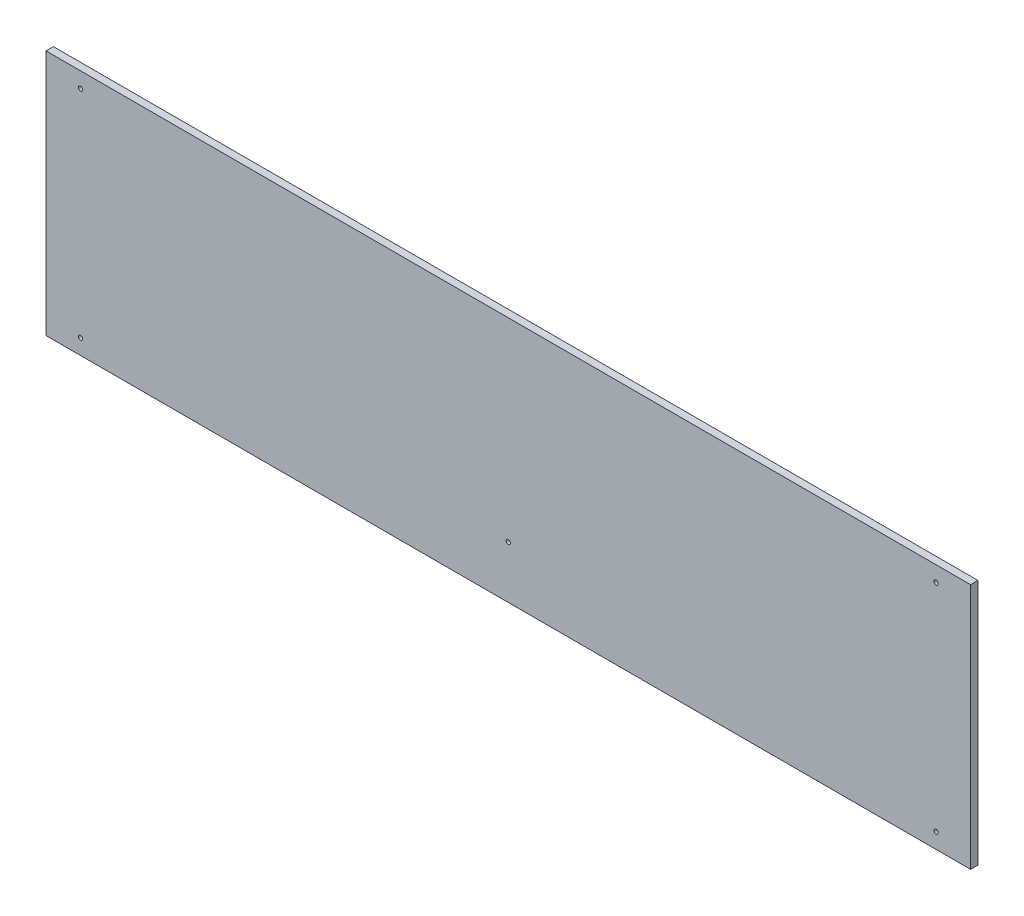
ISO-10303-21;
HEADER;
FILE_DESCRIPTION(('STEP AP214'),'2;1');
FILE_NAME('part.step','',(''),(''),'','','');
FILE_SCHEMA(('AUTOMOTIVE_DESIGN { 1 0 10303 214 1 1 1 1 }'));
ENDSEC;
DATA;
#1=APPLICATION_CONTEXT('core data for automotive mechanical design processes');
#2=APPLICATION_PROTOCOL_DEFINITION('international standard','automotive_design',2000,#1);
#3=PRODUCT_CONTEXT('',#1,'mechanical');
#4=PRODUCT('Part','Part','',(#3));
#5=PRODUCT_RELATED_PRODUCT_CATEGORY('part','',(#4));
#6=PRODUCT_DEFINITION_FORMATION('','',#4);
#7=PRODUCT_DEFINITION_CONTEXT('part definition',#1,'design');
#8=PRODUCT_DEFINITION('design','',#6,#7);
#9=PRODUCT_DEFINITION_SHAPE('','',#8);
#10=(LENGTH_UNIT() NAMED_UNIT(*) SI_UNIT(.MILLI.,.METRE.));
#11=(NAMED_UNIT(*) PLANE_ANGLE_UNIT() SI_UNIT($,.RADIAN.));
#12=(NAMED_UNIT(*) SI_UNIT($,.STERADIAN.) SOLID_ANGLE_UNIT());
#13=UNCERTAINTY_MEASURE_WITH_UNIT(LENGTH_MEASURE(1.E-05),#10,'distance_accuracy_value','');
#14=(GEOMETRIC_REPRESENTATION_CONTEXT(3) GLOBAL_UNCERTAINTY_ASSIGNED_CONTEXT((#13)) GLOBAL_UNIT_ASSIGNED_CONTEXT((#10,
#11,#12)) REPRESENTATION_CONTEXT('',''));
#15=CARTESIAN_POINT('',(0.,0.,0.));
#16=DIRECTION('',(0.,0.,1.));
#17=DIRECTION('',(1.,0.,0.));
#18=AXIS2_PLACEMENT_3D('',#15,#16,#17);
#19=CARTESIAN_POINT('',(-750.,-200.,12.));
#20=DIRECTION('',(1.,0.,0.));
#21=DIRECTION('',(0.,0.,-1.));
#22=AXIS2_PLACEMENT_3D('',#19,#20,#21);
#23=PLANE('',#22);
#24=DIRECTION('',(0.,-1.,0.));
#25=VECTOR('',#24,1.);
#26=CARTESIAN_POINT('',(-750.,-200.,0.));
#27=LINE('',#26,#25);
#28=CARTESIAN_POINT('',(-750.,200.,0.));
#29=VERTEX_POINT('',#28);
#30=CARTESIAN_POINT('',(-750.,-200.,0.));
#31=VERTEX_POINT('',#30);
#32=EDGE_CURVE('E97',#29,#31,#27,.T.);
#33=ORIENTED_EDGE('',*,*,#32,.T.);
#34=DIRECTION('',(0.,0.,-1.));
#35=VECTOR('',#34,1.);
#36=CARTESIAN_POINT('',(-750.,-200.,12.));
#37=LINE('',#36,#35);
#38=CARTESIAN_POINT('',(-750.,-200.,12.));
#39=VERTEX_POINT('',#38);
#40=EDGE_CURVE('E11',#39,#31,#37,.T.);
#41=ORIENTED_EDGE('',*,*,#40,.F.);
#42=DIRECTION('',(0.,-1.,0.));
#43=VECTOR('',#42,1.);
#44=CARTESIAN_POINT('',(-750.,-200.,12.));
#45=LINE('',#44,#43);
#46=CARTESIAN_POINT('',(-750.,200.,12.));
#47=VERTEX_POINT('',#46);
#48=EDGE_CURVE('E85',#47,#39,#45,.T.);
#49=ORIENTED_EDGE('',*,*,#48,.F.);
#50=DIRECTION('',(0.,0.,-1.));
#51=VECTOR('',#50,1.);
#52=CARTESIAN_POINT('',(-750.,200.,12.));
#53=LINE('',#52,#51);
#54=EDGE_CURVE('E93',#47,#29,#53,.T.);
#55=ORIENTED_EDGE('',*,*,#54,.T.);
#56=EDGE_LOOP('',(#33,#41,#49,#55));
#57=FACE_BOUND('',#56,.T.);
#58=ADVANCED_FACE('F34',(#57),#23,.F.);
#59=CARTESIAN_POINT('',(750.,-200.,12.));
#60=DIRECTION('',(0.,1.,0.));
#61=DIRECTION('',(-1.,0.,0.));
#62=AXIS2_PLACEMENT_3D('',#59,#60,#61);
#63=PLANE('',#62);
#64=DIRECTION('',(1.,0.,0.));
#65=VECTOR('',#64,1.);
#66=CARTESIAN_POINT('',(750.,-200.,0.));
#67=LINE('',#66,#65);
#68=CARTESIAN_POINT('',(750.,-200.,0.));
#69=VERTEX_POINT('',#68);
#70=EDGE_CURVE('E89',#31,#69,#67,.T.);
#71=ORIENTED_EDGE('',*,*,#70,.T.);
#72=DIRECTION('',(0.,0.,-1.));
#73=VECTOR('',#72,1.);
#74=CARTESIAN_POINT('',(750.,-200.,12.));
#75=LINE('',#74,#73);
#76=CARTESIAN_POINT('',(750.,-200.,12.));
#77=VERTEX_POINT('',#76);
#78=EDGE_CURVE('E42',#77,#69,#75,.T.);
#79=ORIENTED_EDGE('',*,*,#78,.F.);
#80=DIRECTION('',(1.,0.,0.));
#81=VECTOR('',#80,1.);
#82=CARTESIAN_POINT('',(750.,-200.,12.));
#83=LINE('',#82,#81);
#84=EDGE_CURVE('E80',#39,#77,#83,.T.);
#85=ORIENTED_EDGE('',*,*,#84,.F.);
#86=ORIENTED_EDGE('',*,*,#40,.T.);
#87=EDGE_LOOP('',(#71,#79,#85,#86));
#88=FACE_BOUND('',#87,.T.);
#89=ADVANCED_FACE('F88',(#88),#63,.F.);
#90=CARTESIAN_POINT('',(750.,-200.,12.));
#91=DIRECTION('',(-1.,0.,0.));
#92=DIRECTION('',(0.,0.,1.));
#93=AXIS2_PLACEMENT_3D('',#90,#91,#92);
#94=PLANE('',#93);
#95=DIRECTION('',(0.,1.,0.));
#96=VECTOR('',#95,1.);
#97=CARTESIAN_POINT('',(750.,-200.,0.));
#98=LINE('',#97,#96);
#99=CARTESIAN_POINT('',(750.,200.,0.));
#100=VERTEX_POINT('',#99);
#101=EDGE_CURVE('E67',#69,#100,#98,.T.);
#102=ORIENTED_EDGE('',*,*,#101,.T.);
#103=DIRECTION('',(0.,0.,-1.));
#104=VECTOR('',#103,1.);
#105=CARTESIAN_POINT('',(750.,200.,12.));
#106=LINE('',#105,#104);
#107=CARTESIAN_POINT('',(750.,200.,12.));
#108=VERTEX_POINT('',#107);
#109=EDGE_CURVE('E90',#108,#100,#106,.T.);
#110=ORIENTED_EDGE('',*,*,#109,.F.);
#111=DIRECTION('',(0.,1.,0.));
#112=VECTOR('',#111,1.);
#113=CARTESIAN_POINT('',(750.,-200.,12.));
#114=LINE('',#113,#112);
#115=EDGE_CURVE('E83',#77,#108,#114,.T.);
#116=ORIENTED_EDGE('',*,*,#115,.F.);
#117=ORIENTED_EDGE('',*,*,#78,.T.);
#118=EDGE_LOOP('',(#102,#110,#116,#117));
#119=FACE_BOUND('',#118,.T.);
#120=ADVANCED_FACE('F91',(#119),#94,.F.);
#121=CARTESIAN_POINT('',(750.,200.,12.));
#122=DIRECTION('',(0.,-1.,0.));
#123=DIRECTION('',(1.,0.,0.));
#124=AXIS2_PLACEMENT_3D('',#121,#122,#123);
#125=PLANE('',#124);
#126=DIRECTION('',(-1.,0.,0.));
#127=VECTOR('',#126,1.);
#128=CARTESIAN_POINT('',(750.,200.,0.));
#129=LINE('',#128,#127);
#130=EDGE_CURVE('E73',#100,#29,#129,.T.);
#131=ORIENTED_EDGE('',*,*,#130,.T.);
#132=ORIENTED_EDGE('',*,*,#54,.F.);
#133=DIRECTION('',(-1.,0.,0.));
#134=VECTOR('',#133,1.);
#135=CARTESIAN_POINT('',(750.,200.,12.));
#136=LINE('',#135,#134);
#137=EDGE_CURVE('E50',#108,#47,#136,.T.);
#138=ORIENTED_EDGE('',*,*,#137,.F.);
#139=ORIENTED_EDGE('',*,*,#109,.T.);
#140=EDGE_LOOP('',(#131,#132,#138,#139));
#141=FACE_BOUND('',#140,.T.);
#142=ADVANCED_FACE('F105',(#141),#125,.F.);
#143=CARTESIAN_POINT('',(0.,0.,12.));
#144=DIRECTION('',(0.,0.,1.));
#145=DIRECTION('',(1.,0.,0.));
#146=AXIS2_PLACEMENT_3D('',#143,#144,#145);
#147=PLANE('',#146);
#148=CARTESIAN_POINT('',(694.,175.,12.));
#149=DIRECTION('',(0.,0.,-1.));
#150=DIRECTION('',(-1.,0.,0.));
#151=AXIS2_PLACEMENT_3D('',#148,#149,#150);
#152=CIRCLE('',#151,3.49999999999995);
#153=CARTESIAN_POINT('',(690.5,175.,12.));
#154=VERTEX_POINT('',#153);
#155=EDGE_CURVE('E134',#154,#154,#152,.T.);
#156=ORIENTED_EDGE('',*,*,#155,.T.);
#157=EDGE_LOOP('',(#156));
#158=FACE_BOUND('',#157,.T.);
#159=CARTESIAN_POINT('',(694.,-175.,12.));
#160=DIRECTION('',(0.,0.,-1.));
#161=DIRECTION('',(-1.,0.,0.));
#162=AXIS2_PLACEMENT_3D('',#159,#160,#161);
#163=CIRCLE('',#162,3.49999999999995);
#164=CARTESIAN_POINT('',(690.5,-175.,12.));
#165=VERTEX_POINT('',#164);
#166=EDGE_CURVE('E128',#165,#165,#163,.T.);
#167=ORIENTED_EDGE('',*,*,#166,.T.);
#168=EDGE_LOOP('',(#167));
#169=FACE_BOUND('',#168,.T.);
#170=CARTESIAN_POINT('',(-694.,-175.,12.));
#171=DIRECTION('',(0.,0.,-1.));
#172=DIRECTION('',(-1.,0.,0.));
#173=AXIS2_PLACEMENT_3D('',#170,#171,#172);
#174=CIRCLE('',#173,3.49999999999995);
#175=CARTESIAN_POINT('',(-697.5,-175.,12.));
#176=VERTEX_POINT('',#175);
#177=EDGE_CURVE('E122',#176,#176,#174,.T.);
#178=ORIENTED_EDGE('',*,*,#177,.T.);
#179=EDGE_LOOP('',(#178));
#180=FACE_BOUND('',#179,.T.);
#181=CARTESIAN_POINT('',(-694.,175.,12.));
#182=DIRECTION('',(0.,0.,-1.));
#183=DIRECTION('',(-1.,0.,0.));
#184=AXIS2_PLACEMENT_3D('',#181,#182,#183);
#185=CIRCLE('',#184,3.49999999999995);
#186=CARTESIAN_POINT('',(-697.5,175.,12.));
#187=VERTEX_POINT('',#186);
#188=EDGE_CURVE('E116',#187,#187,#185,.T.);
#189=ORIENTED_EDGE('',*,*,#188,.T.);
#190=EDGE_LOOP('',(#189));
#191=FACE_BOUND('',#190,.T.);
#192=CARTESIAN_POINT('',(0.,-115.,12.));
#193=DIRECTION('',(0.,0.,-1.));
#194=DIRECTION('',(-1.,0.,0.));
#195=AXIS2_PLACEMENT_3D('',#192,#193,#194);
#196=CIRCLE('',#195,3.5);
#197=CARTESIAN_POINT('',(-3.5,-115.,12.));
#198=VERTEX_POINT('',#197);
#199=EDGE_CURVE('E100',#198,#198,#196,.T.);
#200=ORIENTED_EDGE('',*,*,#199,.T.);
#201=EDGE_LOOP('',(#200));
#202=FACE_BOUND('',#201,.T.);
#203=ORIENTED_EDGE('',*,*,#48,.T.);
#204=ORIENTED_EDGE('',*,*,#84,.T.);
#205=ORIENTED_EDGE('',*,*,#115,.T.);
#206=ORIENTED_EDGE('',*,*,#137,.T.);
#207=EDGE_LOOP('',(#203,#204,#205,#206));
#208=FACE_BOUND('',#207,.T.);
#209=ADVANCED_FACE('F81',(#158,#169,#180,#191,#202,#208),#147,.T.);
#210=CARTESIAN_POINT('',(0.,0.,0.));
#211=DIRECTION('',(0.,0.,1.));
#212=DIRECTION('',(1.,0.,0.));
#213=AXIS2_PLACEMENT_3D('',#210,#211,#212);
#214=PLANE('',#213);
#215=CARTESIAN_POINT('',(694.,175.,0.));
#216=DIRECTION('',(0.,0.,-1.));
#217=DIRECTION('',(-1.,0.,0.));
#218=AXIS2_PLACEMENT_3D('',#215,#216,#217);
#219=CIRCLE('',#218,3.49999999999995);
#220=CARTESIAN_POINT('',(690.5,175.,0.));
#221=VERTEX_POINT('',#220);
#222=EDGE_CURVE('E137',#221,#221,#219,.T.);
#223=ORIENTED_EDGE('',*,*,#222,.F.);
#224=EDGE_LOOP('',(#223));
#225=FACE_BOUND('',#224,.T.);
#226=CARTESIAN_POINT('',(694.,-175.,0.));
#227=DIRECTION('',(0.,0.,-1.));
#228=DIRECTION('',(-1.,0.,0.));
#229=AXIS2_PLACEMENT_3D('',#226,#227,#228);
#230=CIRCLE('',#229,3.49999999999995);
#231=CARTESIAN_POINT('',(690.5,-175.,0.));
#232=VERTEX_POINT('',#231);
#233=EDGE_CURVE('E131',#232,#232,#230,.T.);
#234=ORIENTED_EDGE('',*,*,#233,.F.);
#235=EDGE_LOOP('',(#234));
#236=FACE_BOUND('',#235,.T.);
#237=CARTESIAN_POINT('',(-694.,-175.,0.));
#238=DIRECTION('',(0.,0.,-1.));
#239=DIRECTION('',(-1.,0.,0.));
#240=AXIS2_PLACEMENT_3D('',#237,#238,#239);
#241=CIRCLE('',#240,3.49999999999995);
#242=CARTESIAN_POINT('',(-697.5,-175.,0.));
#243=VERTEX_POINT('',#242);
#244=EDGE_CURVE('E125',#243,#243,#241,.T.);
#245=ORIENTED_EDGE('',*,*,#244,.F.);
#246=EDGE_LOOP('',(#245));
#247=FACE_BOUND('',#246,.T.);
#248=CARTESIAN_POINT('',(-694.,175.,0.));
#249=DIRECTION('',(0.,0.,-1.));
#250=DIRECTION('',(-1.,0.,0.));
#251=AXIS2_PLACEMENT_3D('',#248,#249,#250);
#252=CIRCLE('',#251,3.49999999999995);
#253=CARTESIAN_POINT('',(-697.5,175.,0.));
#254=VERTEX_POINT('',#253);
#255=EDGE_CURVE('E119',#254,#254,#252,.T.);
#256=ORIENTED_EDGE('',*,*,#255,.F.);
#257=EDGE_LOOP('',(#256));
#258=FACE_BOUND('',#257,.T.);
#259=CARTESIAN_POINT('',(0.,-115.,0.));
#260=DIRECTION('',(0.,0.,-1.));
#261=DIRECTION('',(-1.,0.,0.));
#262=AXIS2_PLACEMENT_3D('',#259,#260,#261);
#263=CIRCLE('',#262,3.5);
#264=CARTESIAN_POINT('',(-3.5,-115.,0.));
#265=VERTEX_POINT('',#264);
#266=EDGE_CURVE('E113',#265,#265,#263,.T.);
#267=ORIENTED_EDGE('',*,*,#266,.F.);
#268=EDGE_LOOP('',(#267));
#269=FACE_BOUND('',#268,.T.);
#270=ORIENTED_EDGE('',*,*,#32,.F.);
#271=ORIENTED_EDGE('',*,*,#130,.F.);
#272=ORIENTED_EDGE('',*,*,#101,.F.);
#273=ORIENTED_EDGE('',*,*,#70,.F.);
#274=EDGE_LOOP('',(#270,#271,#272,#273));
#275=FACE_BOUND('',#274,.T.);
#276=ADVANCED_FACE('F108',(#225,#236,#247,#258,#269,#275),#214,.F.);
#277=CARTESIAN_POINT('',(0.,-115.,0.));
#278=DIRECTION('',(0.,0.,-1.));
#279=DIRECTION('',(-1.,0.,0.));
#280=AXIS2_PLACEMENT_3D('',#277,#278,#279);
#281=CYLINDRICAL_SURFACE('',#280,3.5);
#282=ORIENTED_EDGE('',*,*,#199,.F.);
#283=EDGE_LOOP('',(#282));
#284=FACE_BOUND('',#283,.T.);
#285=ORIENTED_EDGE('',*,*,#266,.T.);
#286=EDGE_LOOP('',(#285));
#287=FACE_BOUND('',#286,.T.);
#288=ADVANCED_FACE('F145',(#284,#287),#281,.F.);
#289=CARTESIAN_POINT('',(-694.,175.,0.));
#290=DIRECTION('',(0.,0.,-1.));
#291=DIRECTION('',(-1.,0.,0.));
#292=AXIS2_PLACEMENT_3D('',#289,#290,#291);
#293=CYLINDRICAL_SURFACE('',#292,3.49999999999995);
#294=ORIENTED_EDGE('',*,*,#188,.F.);
#295=EDGE_LOOP('',(#294));
#296=FACE_BOUND('',#295,.T.);
#297=ORIENTED_EDGE('',*,*,#255,.T.);
#298=EDGE_LOOP('',(#297));
#299=FACE_BOUND('',#298,.T.);
#300=ADVANCED_FACE('F156',(#296,#299),#293,.F.);
#301=CARTESIAN_POINT('',(-694.,-175.,0.));
#302=DIRECTION('',(0.,0.,-1.));
#303=DIRECTION('',(-1.,0.,0.));
#304=AXIS2_PLACEMENT_3D('',#301,#302,#303);
#305=CYLINDRICAL_SURFACE('',#304,3.49999999999995);
#306=ORIENTED_EDGE('',*,*,#177,.F.);
#307=EDGE_LOOP('',(#306));
#308=FACE_BOUND('',#307,.T.);
#309=ORIENTED_EDGE('',*,*,#244,.T.);
#310=EDGE_LOOP('',(#309));
#311=FACE_BOUND('',#310,.T.);
#312=ADVANCED_FACE('F162',(#308,#311),#305,.F.);
#313=CARTESIAN_POINT('',(694.,-175.,0.));
#314=DIRECTION('',(0.,0.,-1.));
#315=DIRECTION('',(-1.,0.,0.));
#316=AXIS2_PLACEMENT_3D('',#313,#314,#315);
#317=CYLINDRICAL_SURFACE('',#316,3.49999999999995);
#318=ORIENTED_EDGE('',*,*,#166,.F.);
#319=EDGE_LOOP('',(#318));
#320=FACE_BOUND('',#319,.T.);
#321=ORIENTED_EDGE('',*,*,#233,.T.);
#322=EDGE_LOOP('',(#321));
#323=FACE_BOUND('',#322,.T.);
#324=ADVANCED_FACE('F193',(#320,#323),#317,.F.);
#325=CARTESIAN_POINT('',(694.,175.,0.));
#326=DIRECTION('',(0.,0.,-1.));
#327=DIRECTION('',(-1.,0.,0.));
#328=AXIS2_PLACEMENT_3D('',#325,#326,#327);
#329=CYLINDRICAL_SURFACE('',#328,3.49999999999995);
#330=ORIENTED_EDGE('',*,*,#155,.F.);
#331=EDGE_LOOP('',(#330));
#332=FACE_BOUND('',#331,.T.);
#333=ORIENTED_EDGE('',*,*,#222,.T.);
#334=EDGE_LOOP('',(#333));
#335=FACE_BOUND('',#334,.T.);
#336=ADVANCED_FACE('F141',(#332,#335),#329,.F.);
#337=CLOSED_SHELL('',(#58,#89,#120,#142,#209,#276,#288,#300,#312,#324,#336));
#338=MANIFOLD_SOLID_BREP('B2',#337);
#339=ADVANCED_BREP_SHAPE_REPRESENTATION('',(#18,#338),#14);
#340=SHAPE_DEFINITION_REPRESENTATION(#9,#339);
ENDSEC;
END-ISO-10303-21;
